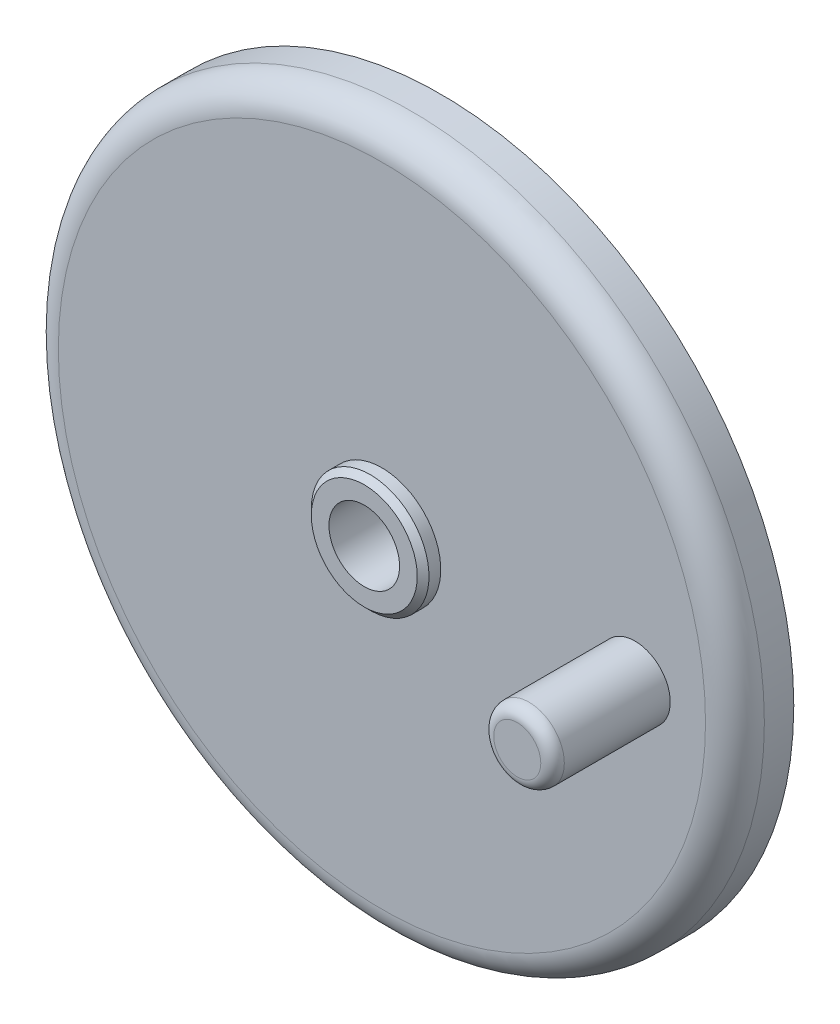
ISO-10303-21;
HEADER;
FILE_DESCRIPTION(('STEP AP214'),'2;1');
FILE_NAME('part.step','',(''),(''),'','','');
FILE_SCHEMA(('AUTOMOTIVE_DESIGN { 1 0 10303 214 1 1 1 1 }'));
ENDSEC;
DATA;
#1=APPLICATION_CONTEXT('core data for automotive mechanical design processes');
#2=APPLICATION_PROTOCOL_DEFINITION('international standard','automotive_design',2000,#1);
#3=PRODUCT_CONTEXT('',#1,'mechanical');
#4=PRODUCT('Part','Part','',(#3));
#5=PRODUCT_RELATED_PRODUCT_CATEGORY('part','',(#4));
#6=PRODUCT_DEFINITION_FORMATION('','',#4);
#7=PRODUCT_DEFINITION_CONTEXT('part definition',#1,'design');
#8=PRODUCT_DEFINITION('design','',#6,#7);
#9=PRODUCT_DEFINITION_SHAPE('','',#8);
#10=(LENGTH_UNIT() NAMED_UNIT(*) SI_UNIT(.MILLI.,.METRE.));
#11=(NAMED_UNIT(*) PLANE_ANGLE_UNIT() SI_UNIT($,.RADIAN.));
#12=(NAMED_UNIT(*) SI_UNIT($,.STERADIAN.) SOLID_ANGLE_UNIT());
#13=UNCERTAINTY_MEASURE_WITH_UNIT(LENGTH_MEASURE(1.E-05),#10,'distance_accuracy_value','');
#14=(GEOMETRIC_REPRESENTATION_CONTEXT(3) GLOBAL_UNCERTAINTY_ASSIGNED_CONTEXT((#13)) GLOBAL_UNIT_ASSIGNED_CONTEXT((#10,
#11,#12)) REPRESENTATION_CONTEXT('',''));
#15=CARTESIAN_POINT('',(0.,0.,0.));
#16=DIRECTION('',(0.,0.,1.));
#17=DIRECTION('',(1.,0.,0.));
#18=AXIS2_PLACEMENT_3D('',#15,#16,#17);
#19=CARTESIAN_POINT('',(0.,0.,10.));
#20=DIRECTION('',(0.,0.,-1.));
#21=DIRECTION('',(-1.,0.,0.));
#22=AXIS2_PLACEMENT_3D('',#19,#20,#21);
#23=CYLINDRICAL_SURFACE('',#22,60.);
#24=CARTESIAN_POINT('',(0.,0.,5.));
#25=DIRECTION('',(0.,0.,1.));
#26=DIRECTION('',(1.,0.,0.));
#27=AXIS2_PLACEMENT_3D('',#24,#25,#26);
#28=CIRCLE('',#27,60.);
#29=CARTESIAN_POINT('',(60.,0.,5.));
#30=VERTEX_POINT('',#29);
#31=EDGE_CURVE('E65',#30,#30,#28,.F.);
#32=ORIENTED_EDGE('',*,*,#31,.T.);
#33=EDGE_LOOP('',(#32));
#34=FACE_BOUND('',#33,.T.);
#35=CARTESIAN_POINT('',(0.,0.,0.));
#36=DIRECTION('',(0.,0.,1.));
#37=DIRECTION('',(1.,0.,0.));
#38=AXIS2_PLACEMENT_3D('',#35,#36,#37);
#39=CIRCLE('',#38,60.);
#40=CARTESIAN_POINT('',(60.,0.,0.));
#41=VERTEX_POINT('',#40);
#42=EDGE_CURVE('E71',#41,#41,#39,.T.);
#43=ORIENTED_EDGE('',*,*,#42,.T.);
#44=EDGE_LOOP('',(#43));
#45=FACE_BOUND('',#44,.T.);
#46=ADVANCED_FACE('F45',(#34,#45),#23,.T.);
#47=CARTESIAN_POINT('',(0.,0.,10.));
#48=DIRECTION('',(0.,0.,1.));
#49=DIRECTION('',(1.,0.,0.));
#50=AXIS2_PLACEMENT_3D('',#47,#48,#49);
#51=PLANE('',#50);
#52=CARTESIAN_POINT('',(43.,0.,10.));
#53=DIRECTION('',(0.,0.,1.));
#54=DIRECTION('',(1.,0.,0.));
#55=AXIS2_PLACEMENT_3D('',#52,#53,#54);
#56=CIRCLE('',#55,6.);
#57=CARTESIAN_POINT('',(49.,0.,10.));
#58=VERTEX_POINT('',#57);
#59=EDGE_CURVE('E81',#58,#58,#56,.F.);
#60=ORIENTED_EDGE('',*,*,#59,.T.);
#61=EDGE_LOOP('',(#60));
#62=FACE_BOUND('',#61,.T.);
#63=CARTESIAN_POINT('',(0.,0.,10.));
#64=DIRECTION('',(0.,0.,1.));
#65=DIRECTION('',(1.,0.,0.));
#66=AXIS2_PLACEMENT_3D('',#63,#64,#65);
#67=CIRCLE('',#66,10.);
#68=CARTESIAN_POINT('',(-10.,0.,10.));
#69=VERTEX_POINT('',#68);
#70=EDGE_CURVE('E74',#69,#69,#67,.F.);
#71=ORIENTED_EDGE('',*,*,#70,.T.);
#72=EDGE_LOOP('',(#71));
#73=FACE_BOUND('',#72,.T.);
#74=CARTESIAN_POINT('',(0.,0.,10.));
#75=DIRECTION('',(0.,0.,1.));
#76=DIRECTION('',(1.,0.,0.));
#77=AXIS2_PLACEMENT_3D('',#74,#75,#76);
#78=CIRCLE('',#77,55.);
#79=CARTESIAN_POINT('',(55.,0.,10.));
#80=VERTEX_POINT('',#79);
#81=EDGE_CURVE('E68',#80,#80,#78,.T.);
#82=ORIENTED_EDGE('',*,*,#81,.T.);
#83=EDGE_LOOP('',(#82));
#84=FACE_BOUND('',#83,.T.);
#85=ADVANCED_FACE('F87',(#62,#73,#84),#51,.T.);
#86=CARTESIAN_POINT('',(0.,0.,0.));
#87=DIRECTION('',(0.,0.,1.));
#88=DIRECTION('',(1.,0.,0.));
#89=AXIS2_PLACEMENT_3D('',#86,#87,#88);
#90=PLANE('',#89);
#91=CARTESIAN_POINT('',(0.,0.,0.));
#92=DIRECTION('',(0.,0.,1.));
#93=DIRECTION('',(1.,0.,0.));
#94=AXIS2_PLACEMENT_3D('',#91,#92,#93);
#95=CIRCLE('',#94,6.);
#96=CARTESIAN_POINT('',(-6.,0.,0.));
#97=VERTEX_POINT('',#96);
#98=EDGE_CURVE('E78',#97,#97,#95,.T.);
#99=ORIENTED_EDGE('',*,*,#98,.T.);
#100=EDGE_LOOP('',(#99));
#101=FACE_BOUND('',#100,.T.);
#102=ORIENTED_EDGE('',*,*,#42,.F.);
#103=EDGE_LOOP('',(#102));
#104=FACE_BOUND('',#103,.T.);
#105=ADVANCED_FACE('F110',(#101,#104),#90,.F.);
#106=CARTESIAN_POINT('',(0.,0.,5.));
#107=DIRECTION('',(0.,0.,1.));
#108=DIRECTION('',(1.,0.,0.));
#109=AXIS2_PLACEMENT_3D('',#106,#107,#108);
#110=TOROIDAL_SURFACE('',#109,55.,5.);
#111=ORIENTED_EDGE('',*,*,#31,.F.);
#112=EDGE_LOOP('',(#111));
#113=FACE_BOUND('',#112,.T.);
#114=ORIENTED_EDGE('',*,*,#81,.F.);
#115=EDGE_LOOP('',(#114));
#116=FACE_BOUND('',#115,.T.);
#117=ADVANCED_FACE('F115',(#113,#116),#110,.T.);
#118=CARTESIAN_POINT('',(0.,0.,13.));
#119=DIRECTION('',(0.,0.,-1.));
#120=DIRECTION('',(-1.,0.,0.));
#121=AXIS2_PLACEMENT_3D('',#118,#119,#120);
#122=CYLINDRICAL_SURFACE('',#121,10.);
#123=CARTESIAN_POINT('',(0.,0.,12.0000000000001));
#124=DIRECTION('',(0.,0.,1.));
#125=DIRECTION('',(1.,0.,0.));
#126=AXIS2_PLACEMENT_3D('',#123,#124,#125);
#127=CIRCLE('',#126,10.);
#128=CARTESIAN_POINT('',(-10.,0.,12.0000000000001));
#129=VERTEX_POINT('',#128);
#130=EDGE_CURVE('E56',#129,#129,#127,.F.);
#131=CARTESIAN_POINT('',(-10.,0.,12.0000000000001));
#132=CARTESIAN_POINT('',(-10.,0.,11.9791666666667));
#133=CARTESIAN_POINT('',(-10.,0.,11.9583333333334));
#134=CARTESIAN_POINT('',(-10.,0.,11.9166666666667));
#135=CARTESIAN_POINT('',(-10.,0.,11.8958333333334));
#136=CARTESIAN_POINT('',(-10.,0.,11.8541666666667));
#137=CARTESIAN_POINT('',(-10.,0.,11.8333333333334));
#138=CARTESIAN_POINT('',(-10.,0.,11.7916666666667));
#139=CARTESIAN_POINT('',(-10.,0.,11.7708333333334));
#140=CARTESIAN_POINT('',(-10.,0.,11.7291666666667));
#141=CARTESIAN_POINT('',(-10.,0.,11.7083333333334));
#142=CARTESIAN_POINT('',(-10.,0.,11.6666666666667));
#143=CARTESIAN_POINT('',(-10.,0.,11.6458333333334));
#144=CARTESIAN_POINT('',(-10.,0.,11.6041666666667));
#145=CARTESIAN_POINT('',(-10.,0.,11.5833333333334));
#146=CARTESIAN_POINT('',(-10.,0.,11.5416666666667));
#147=CARTESIAN_POINT('',(-10.,0.,11.5208333333334));
#148=CARTESIAN_POINT('',(-10.,0.,11.4791666666667));
#149=CARTESIAN_POINT('',(-10.,0.,11.4583333333334));
#150=CARTESIAN_POINT('',(-10.,0.,11.4166666666667));
#151=CARTESIAN_POINT('',(-10.,0.,11.3958333333334));
#152=CARTESIAN_POINT('',(-10.,0.,11.3541666666667));
#153=CARTESIAN_POINT('',(-10.,0.,11.3333333333334));
#154=CARTESIAN_POINT('',(-10.,0.,11.2916666666667));
#155=CARTESIAN_POINT('',(-10.,0.,11.2708333333334));
#156=CARTESIAN_POINT('',(-10.,0.,11.2291666666667));
#157=CARTESIAN_POINT('',(-10.,0.,11.2083333333334));
#158=CARTESIAN_POINT('',(-10.,0.,11.1666666666667));
#159=CARTESIAN_POINT('',(-10.,0.,11.1458333333334));
#160=CARTESIAN_POINT('',(-10.,0.,11.1041666666667));
#161=CARTESIAN_POINT('',(-10.,0.,11.0833333333334));
#162=CARTESIAN_POINT('',(-10.,0.,11.0416666666667));
#163=CARTESIAN_POINT('',(-10.,0.,11.0208333333334));
#164=CARTESIAN_POINT('',(-10.,0.,10.9791666666667));
#165=CARTESIAN_POINT('',(-10.,0.,10.9583333333334));
#166=CARTESIAN_POINT('',(-10.,0.,10.9166666666667));
#167=CARTESIAN_POINT('',(-10.,0.,10.8958333333334));
#168=CARTESIAN_POINT('',(-10.,0.,10.8541666666667));
#169=CARTESIAN_POINT('',(-10.,0.,10.8333333333334));
#170=CARTESIAN_POINT('',(-10.,0.,10.7916666666667));
#171=CARTESIAN_POINT('',(-10.,0.,10.7708333333334));
#172=CARTESIAN_POINT('',(-10.,0.,10.7291666666667));
#173=CARTESIAN_POINT('',(-10.,0.,10.7083333333334));
#174=CARTESIAN_POINT('',(-10.,0.,10.6666666666667));
#175=CARTESIAN_POINT('',(-10.,0.,10.6458333333334));
#176=CARTESIAN_POINT('',(-10.,0.,10.6041666666667));
#177=CARTESIAN_POINT('',(-10.,0.,10.5833333333334));
#178=CARTESIAN_POINT('',(-10.,0.,10.5416666666667));
#179=CARTESIAN_POINT('',(-10.,0.,10.5208333333333));
#180=CARTESIAN_POINT('',(-10.,0.,10.4791666666667));
#181=CARTESIAN_POINT('',(-10.,0.,10.4583333333333));
#182=CARTESIAN_POINT('',(-10.,0.,10.4166666666667));
#183=CARTESIAN_POINT('',(-10.,0.,10.3958333333333));
#184=CARTESIAN_POINT('',(-10.,0.,10.3541666666667));
#185=CARTESIAN_POINT('',(-10.,0.,10.3333333333333));
#186=CARTESIAN_POINT('',(-10.,0.,10.2916666666667));
#187=CARTESIAN_POINT('',(-10.,0.,10.2708333333333));
#188=CARTESIAN_POINT('',(-10.,0.,10.2291666666667));
#189=CARTESIAN_POINT('',(-10.,0.,10.2083333333333));
#190=CARTESIAN_POINT('',(-10.,0.,10.1666666666667));
#191=CARTESIAN_POINT('',(-10.,0.,10.1458333333333));
#192=CARTESIAN_POINT('',(-10.,0.,10.1041666666667));
#193=CARTESIAN_POINT('',(-10.,0.,10.0833333333333));
#194=CARTESIAN_POINT('',(-10.,0.,10.0416666666667));
#195=CARTESIAN_POINT('',(-10.,0.,10.0208333333333));
#196=CARTESIAN_POINT('',(-10.,0.,10.));
#197=B_SPLINE_CURVE_WITH_KNOTS('',3,(#131,#132,#133,#134,#135,#136,#137,#138,#139,#140,#141,
#142,#143,#144,#145,#146,#147,#148,#149,#150,#151,#152,#153,#154,#155,#156,#157,#158,#159,#160,
#161,#162,#163,#164,#165,#166,#167,#168,#169,#170,#171,#172,#173,#174,#175,#176,#177,#178,#179,
#180,#181,#182,#183,#184,#185,#186,#187,#188,#189,#190,#191,#192,#193,#194,#195,#196),
.UNSPECIFIED.,.F.,.F.,(4,2,2,2,2,2,2,2,2,2,2,2,2,2,2,2,2,2,2,2,2,2,2,2,2,2,2,2,2,2,2,2,4),(0.,
0.0625000000000035,0.125000000000005,0.187500000000007,0.250000000000009,0.312500000000011,
0.375000000000012,0.437500000000016,0.500000000000018,0.56250000000002,0.625000000000021,
0.687500000000023,0.750000000000027,0.812500000000028,0.87500000000003,0.937500000000032,
1.00000000000003,1.06250000000004,1.12500000000004,1.18750000000004,1.25000000000004,
1.31250000000004,1.37500000000005,1.43750000000005,1.50000000000005,1.56250000000005,
1.62500000000006,1.68750000000006,1.75000000000006,1.81250000000006,1.87500000000006,
1.93750000000007,2.00000000000007),.UNSPECIFIED.);
#198=EDGE_CURVE('BSEAM117',#129,#69,#197,.T.);
#199=ORIENTED_EDGE('',*,*,#130,.T.);
#200=ORIENTED_EDGE('',*,*,#70,.F.);
#201=ORIENTED_EDGE('',*,*,#198,.T.);
#202=ORIENTED_EDGE('',*,*,#198,.F.);
#203=EDGE_LOOP('',(#199,#201,#200,#202));
#204=FACE_BOUND('',#203,.T.);
#205=ADVANCED_FACE('F117',(#204),#122,.T.);
#206=CARTESIAN_POINT('',(0.,0.,13.));
#207=DIRECTION('',(0.,0.,1.));
#208=DIRECTION('',(1.,0.,0.));
#209=AXIS2_PLACEMENT_3D('',#206,#207,#208);
#210=PLANE('',#209);
#211=CARTESIAN_POINT('',(0.,0.,13.));
#212=DIRECTION('',(0.,0.,1.));
#213=DIRECTION('',(1.,0.,0.));
#214=AXIS2_PLACEMENT_3D('',#211,#212,#213);
#215=CIRCLE('',#214,9.00000000000008);
#216=CARTESIAN_POINT('',(9.00000000000008,0.,13.));
#217=VERTEX_POINT('',#216);
#218=EDGE_CURVE('E60',#217,#217,#215,.T.);
#219=ORIENTED_EDGE('',*,*,#218,.T.);
#220=EDGE_LOOP('',(#219));
#221=FACE_BOUND('',#220,.T.);
#222=CARTESIAN_POINT('',(0.,0.,13.));
#223=DIRECTION('',(0.,0.,1.));
#224=DIRECTION('',(1.,0.,0.));
#225=AXIS2_PLACEMENT_3D('',#222,#223,#224);
#226=CIRCLE('',#225,6.);
#227=CARTESIAN_POINT('',(-6.,0.,13.));
#228=VERTEX_POINT('',#227);
#229=EDGE_CURVE('E77',#228,#228,#226,.T.);
#230=ORIENTED_EDGE('',*,*,#229,.F.);
#231=EDGE_LOOP('',(#230));
#232=FACE_BOUND('',#231,.T.);
#233=ADVANCED_FACE('F127',(#221,#232),#210,.T.);
#234=CARTESIAN_POINT('',(0.,0.,13.));
#235=DIRECTION('',(0.,0.,-1.));
#236=DIRECTION('',(-1.,0.,0.));
#237=AXIS2_PLACEMENT_3D('',#234,#235,#236);
#238=CYLINDRICAL_SURFACE('',#237,6.);
#239=CARTESIAN_POINT('',(-6.,0.,13.));
#240=CARTESIAN_POINT('',(-6.,0.,12.8645833333333));
#241=CARTESIAN_POINT('',(-6.,0.,12.7291666666667));
#242=CARTESIAN_POINT('',(-6.,0.,12.4583333333333));
#243=CARTESIAN_POINT('',(-6.,0.,12.3229166666667));
#244=CARTESIAN_POINT('',(-6.,0.,12.0520833333333));
#245=CARTESIAN_POINT('',(-6.,0.,11.9166666666667));
#246=CARTESIAN_POINT('',(-6.,0.,11.6458333333333));
#247=CARTESIAN_POINT('',(-6.,0.,11.5104166666667));
#248=CARTESIAN_POINT('',(-6.,0.,11.2395833333333));
#249=CARTESIAN_POINT('',(-6.,0.,11.1041666666667));
#250=CARTESIAN_POINT('',(-6.,0.,10.8333333333333));
#251=CARTESIAN_POINT('',(-6.,0.,10.6979166666667));
#252=CARTESIAN_POINT('',(-6.,0.,10.4270833333333));
#253=CARTESIAN_POINT('',(-6.,0.,10.2916666666667));
#254=CARTESIAN_POINT('',(-6.,0.,10.0208333333333));
#255=CARTESIAN_POINT('',(-6.,0.,9.88541666666667));
#256=CARTESIAN_POINT('',(-6.,0.,9.61458333333333));
#257=CARTESIAN_POINT('',(-6.,0.,9.47916666666667));
#258=CARTESIAN_POINT('',(-6.,0.,9.20833333333333));
#259=CARTESIAN_POINT('',(-6.,0.,9.07291666666666));
#260=CARTESIAN_POINT('',(-6.,0.,8.80208333333333));
#261=CARTESIAN_POINT('',(-6.,0.,8.66666666666667));
#262=CARTESIAN_POINT('',(-6.,0.,8.39583333333333));
#263=CARTESIAN_POINT('',(-6.,0.,8.26041666666667));
#264=CARTESIAN_POINT('',(-6.,0.,7.98958333333333));
#265=CARTESIAN_POINT('',(-6.,0.,7.85416666666667));
#266=CARTESIAN_POINT('',(-6.,0.,7.58333333333333));
#267=CARTESIAN_POINT('',(-6.,0.,7.44791666666667));
#268=CARTESIAN_POINT('',(-6.,0.,7.17708333333333));
#269=CARTESIAN_POINT('',(-6.,0.,7.04166666666667));
#270=CARTESIAN_POINT('',(-6.,0.,6.77083333333333));
#271=CARTESIAN_POINT('',(-6.,0.,6.63541666666667));
#272=CARTESIAN_POINT('',(-6.,0.,6.36458333333333));
#273=CARTESIAN_POINT('',(-6.,0.,6.22916666666667));
#274=CARTESIAN_POINT('',(-6.,0.,5.95833333333333));
#275=CARTESIAN_POINT('',(-6.,0.,5.82291666666667));
#276=CARTESIAN_POINT('',(-6.,0.,5.55208333333333));
#277=CARTESIAN_POINT('',(-6.,0.,5.41666666666667));
#278=CARTESIAN_POINT('',(-6.,0.,5.14583333333333));
#279=CARTESIAN_POINT('',(-6.,0.,5.01041666666667));
#280=CARTESIAN_POINT('',(-6.,0.,4.73958333333333));
#281=CARTESIAN_POINT('',(-6.,0.,4.60416666666667));
#282=CARTESIAN_POINT('',(-6.,0.,4.33333333333333));
#283=CARTESIAN_POINT('',(-6.,0.,4.19791666666667));
#284=CARTESIAN_POINT('',(-6.,0.,3.92708333333333));
#285=CARTESIAN_POINT('',(-6.,0.,3.79166666666667));
#286=CARTESIAN_POINT('',(-6.,0.,3.52083333333333));
#287=CARTESIAN_POINT('',(-6.,0.,3.38541666666667));
#288=CARTESIAN_POINT('',(-6.,0.,3.11458333333333));
#289=CARTESIAN_POINT('',(-6.,0.,2.97916666666667));
#290=CARTESIAN_POINT('',(-6.,0.,2.70833333333333));
#291=CARTESIAN_POINT('',(-6.,0.,2.57291666666667));
#292=CARTESIAN_POINT('',(-6.,0.,2.30208333333333));
#293=CARTESIAN_POINT('',(-6.,0.,2.16666666666667));
#294=CARTESIAN_POINT('',(-6.,0.,1.89583333333333));
#295=CARTESIAN_POINT('',(-6.,0.,1.76041666666667));
#296=CARTESIAN_POINT('',(-6.,0.,1.48958333333333));
#297=CARTESIAN_POINT('',(-6.,0.,1.35416666666667));
#298=CARTESIAN_POINT('',(-6.,0.,1.08333333333333));
#299=CARTESIAN_POINT('',(-6.,0.,0.947916666666667));
#300=CARTESIAN_POINT('',(-6.,0.,0.677083333333334));
#301=CARTESIAN_POINT('',(-6.,0.,0.541666666666667));
#302=CARTESIAN_POINT('',(-6.,0.,0.270833333333334));
#303=CARTESIAN_POINT('',(-6.,0.,0.135416666666667));
#304=CARTESIAN_POINT('',(-6.,0.,0.));
#305=B_SPLINE_CURVE_WITH_KNOTS('',3,(#239,#240,#241,#242,#243,#244,#245,#246,#247,#248,#249,
#250,#251,#252,#253,#254,#255,#256,#257,#258,#259,#260,#261,#262,#263,#264,#265,#266,#267,#268,
#269,#270,#271,#272,#273,#274,#275,#276,#277,#278,#279,#280,#281,#282,#283,#284,#285,#286,#287,
#288,#289,#290,#291,#292,#293,#294,#295,#296,#297,#298,#299,#300,#301,#302,#303,#304),
.UNSPECIFIED.,.F.,.F.,(4,2,2,2,2,2,2,2,2,2,2,2,2,2,2,2,2,2,2,2,2,2,2,2,2,2,2,2,2,2,2,2,4),(0.,
0.40625,0.812500000000001,1.21875,1.625,2.03125,2.4375,2.84375,3.25,3.65625,4.0625,4.46875,
4.875,5.28125,5.6875,6.09375,6.5,6.90625,7.3125,7.71875,8.125,8.53125,8.9375,9.34375,9.75,
10.15625,10.5625,10.96875,11.375,11.78125,12.1875,12.59375,13.),.UNSPECIFIED.);
#306=EDGE_CURVE('BSEAM101',#228,#97,#305,.T.);
#307=ORIENTED_EDGE('',*,*,#229,.T.);
#308=ORIENTED_EDGE('',*,*,#98,.F.);
#309=ORIENTED_EDGE('',*,*,#306,.T.);
#310=ORIENTED_EDGE('',*,*,#306,.F.);
#311=EDGE_LOOP('',(#307,#309,#308,#310));
#312=FACE_BOUND('',#311,.T.);
#313=ADVANCED_FACE('F101',(#312),#238,.F.);
#314=CARTESIAN_POINT('',(0.,0.,13.));
#315=DIRECTION('',(0.,0.,-1.));
#316=DIRECTION('',(-1.,0.,0.));
#317=AXIS2_PLACEMENT_3D('',#314,#315,#316);
#318=CONICAL_SURFACE('',#317,9.00000000000008,0.785398163397445);
#319=ORIENTED_EDGE('',*,*,#130,.F.);
#320=EDGE_LOOP('',(#319));
#321=FACE_BOUND('',#320,.T.);
#322=ORIENTED_EDGE('',*,*,#218,.F.);
#323=EDGE_LOOP('',(#322));
#324=FACE_BOUND('',#323,.T.);
#325=ADVANCED_FACE('F93',(#321,#324),#318,.T.);
#326=CARTESIAN_POINT('',(43.,0.,30.));
#327=DIRECTION('',(0.,0.,-1.));
#328=DIRECTION('',(-1.,0.,0.));
#329=AXIS2_PLACEMENT_3D('',#326,#327,#328);
#330=CYLINDRICAL_SURFACE('',#329,6.);
#331=CARTESIAN_POINT('',(43.,0.,28.));
#332=DIRECTION('',(0.,0.,1.));
#333=DIRECTION('',(1.,0.,0.));
#334=AXIS2_PLACEMENT_3D('',#331,#332,#333);
#335=CIRCLE('',#334,6.);
#336=CARTESIAN_POINT('',(49.,0.,28.));
#337=VERTEX_POINT('',#336);
#338=EDGE_CURVE('E10',#337,#337,#335,.F.);
#339=ORIENTED_EDGE('',*,*,#338,.T.);
#340=EDGE_LOOP('',(#339));
#341=FACE_BOUND('',#340,.T.);
#342=ORIENTED_EDGE('',*,*,#59,.F.);
#343=EDGE_LOOP('',(#342));
#344=FACE_BOUND('',#343,.T.);
#345=ADVANCED_FACE('F90',(#341,#344),#330,.T.);
#346=CARTESIAN_POINT('',(43.,0.,30.));
#347=DIRECTION('',(0.,0.,1.));
#348=DIRECTION('',(1.,0.,0.));
#349=AXIS2_PLACEMENT_3D('',#346,#347,#348);
#350=PLANE('',#349);
#351=CARTESIAN_POINT('',(43.,0.,30.));
#352=DIRECTION('',(0.,0.,1.));
#353=DIRECTION('',(1.,0.,0.));
#354=AXIS2_PLACEMENT_3D('',#351,#352,#353);
#355=CIRCLE('',#354,4.);
#356=CARTESIAN_POINT('',(47.,0.,30.));
#357=VERTEX_POINT('',#356);
#358=EDGE_CURVE('E52',#357,#357,#355,.T.);
#359=ORIENTED_EDGE('',*,*,#358,.T.);
#360=EDGE_LOOP('',(#359));
#361=FACE_BOUND('',#360,.T.);
#362=ADVANCED_FACE('F92',(#361),#350,.T.);
#363=CARTESIAN_POINT('',(43.,0.,28.));
#364=DIRECTION('',(0.,0.,1.));
#365=DIRECTION('',(1.,0.,0.));
#366=AXIS2_PLACEMENT_3D('',#363,#364,#365);
#367=TOROIDAL_SURFACE('',#366,4.,2.);
#368=ORIENTED_EDGE('',*,*,#338,.F.);
#369=EDGE_LOOP('',(#368));
#370=FACE_BOUND('',#369,.T.);
#371=ORIENTED_EDGE('',*,*,#358,.F.);
#372=EDGE_LOOP('',(#371));
#373=FACE_BOUND('',#372,.T.);
#374=ADVANCED_FACE('F47',(#370,#373),#367,.T.);
#375=CLOSED_SHELL('',(#46,#85,#105,#117,#205,#233,#313,#325,#345,#362,#374));
#376=MANIFOLD_SOLID_BREP('B2',#375);
#377=ADVANCED_BREP_SHAPE_REPRESENTATION('',(#18,#376),#14);
#378=SHAPE_DEFINITION_REPRESENTATION(#9,#377);
ENDSEC;
END-ISO-10303-21;
